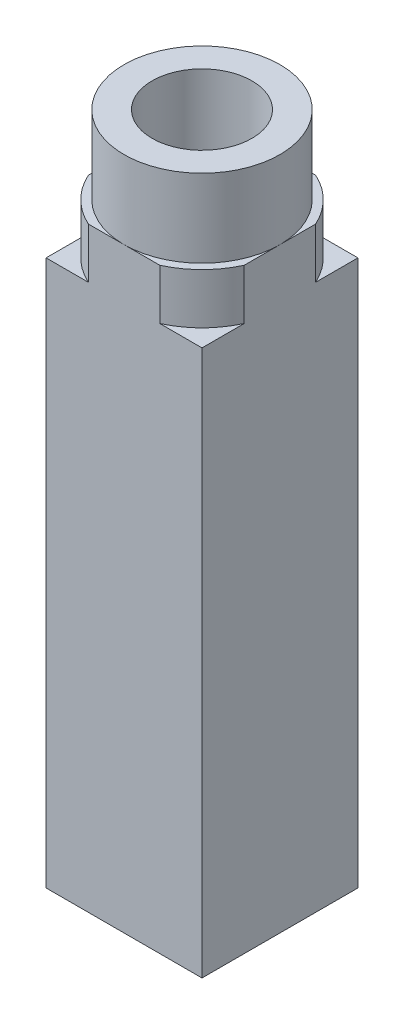
ISO-10303-21;
HEADER;
FILE_DESCRIPTION(('STEP AP214'),'2;1');
FILE_NAME('part.step','',(''),(''),'','','');
FILE_SCHEMA(('AUTOMOTIVE_DESIGN { 1 0 10303 214 1 1 1 1 }'));
ENDSEC;
DATA;
#1=APPLICATION_CONTEXT('core data for automotive mechanical design processes');
#2=APPLICATION_PROTOCOL_DEFINITION('international standard','automotive_design',2000,#1);
#3=PRODUCT_CONTEXT('',#1,'mechanical');
#4=PRODUCT('Part','Part','',(#3));
#5=PRODUCT_RELATED_PRODUCT_CATEGORY('part','',(#4));
#6=PRODUCT_DEFINITION_FORMATION('','',#4);
#7=PRODUCT_DEFINITION_CONTEXT('part definition',#1,'design');
#8=PRODUCT_DEFINITION('design','',#6,#7);
#9=PRODUCT_DEFINITION_SHAPE('','',#8);
#10=(LENGTH_UNIT() NAMED_UNIT(*) SI_UNIT(.MILLI.,.METRE.));
#11=(NAMED_UNIT(*) PLANE_ANGLE_UNIT() SI_UNIT($,.RADIAN.));
#12=(NAMED_UNIT(*) SI_UNIT($,.STERADIAN.) SOLID_ANGLE_UNIT());
#13=UNCERTAINTY_MEASURE_WITH_UNIT(LENGTH_MEASURE(1.E-05),#10,'distance_accuracy_value','');
#14=(GEOMETRIC_REPRESENTATION_CONTEXT(3) GLOBAL_UNCERTAINTY_ASSIGNED_CONTEXT((#13)) GLOBAL_UNIT_ASSIGNED_CONTEXT((#10,
#11,#12)) REPRESENTATION_CONTEXT('',''));
#15=CARTESIAN_POINT('',(0.,0.,0.));
#16=DIRECTION('',(0.,0.,1.));
#17=DIRECTION('',(1.,0.,0.));
#18=AXIS2_PLACEMENT_3D('',#15,#16,#17);
#19=CARTESIAN_POINT('',(0.,22.225,0.));
#20=DIRECTION('',(0.,1.,0.));
#21=DIRECTION('',(0.,0.,1.));
#22=AXIS2_PLACEMENT_3D('',#19,#20,#21);
#23=PLANE('',#22);
#24=DIRECTION('',(0.,0.,-1.));
#25=VECTOR('',#24,1.);
#26=CARTESIAN_POINT('',(3.175,22.225,-3.175));
#27=LINE('',#26,#25);
#28=CARTESIAN_POINT('',(3.175,22.225,3.175));
#29=VERTEX_POINT('',#28);
#30=CARTESIAN_POINT('',(3.175,22.225,1.45496778314848));
#31=VERTEX_POINT('',#30);
#32=EDGE_CURVE('E2280',#29,#31,#27,.T.);
#33=ORIENTED_EDGE('',*,*,#32,.T.);
#34=CARTESIAN_POINT('',(0.,22.225,0.));
#35=DIRECTION('',(0.,1.,0.));
#36=DIRECTION('',(0.,0.,1.));
#37=AXIS2_PLACEMENT_3D('',#34,#35,#36);
#38=CIRCLE('',#37,3.4925);
#39=CARTESIAN_POINT('',(1.45496778314848,22.225,3.175));
#40=VERTEX_POINT('',#39);
#41=EDGE_CURVE('E2369',#31,#40,#38,.F.);
#42=ORIENTED_EDGE('',*,*,#41,.T.);
#43=DIRECTION('',(1.,0.,0.));
#44=VECTOR('',#43,1.);
#45=CARTESIAN_POINT('',(-3.175,22.225,3.175));
#46=LINE('',#45,#44);
#47=EDGE_CURVE('E2295',#40,#29,#46,.T.);
#48=ORIENTED_EDGE('',*,*,#47,.T.);
#49=EDGE_LOOP('',(#33,#42,#48));
#50=FACE_BOUND('',#49,.T.);
#51=ADVANCED_FACE('F2086',(#50),#23,.T.);
#52=DIRECTION('',(-1.,0.,0.));
#53=VECTOR('',#52,1.);
#54=CARTESIAN_POINT('',(-3.175,22.225,-3.175));
#55=LINE('',#54,#53);
#56=CARTESIAN_POINT('',(3.175,22.225,-3.175));
#57=VERTEX_POINT('',#56);
#58=CARTESIAN_POINT('',(1.45496778314848,22.225,-3.175));
#59=VERTEX_POINT('',#58);
#60=EDGE_CURVE('E2281',#57,#59,#55,.T.);
#61=ORIENTED_EDGE('',*,*,#60,.T.);
#62=CARTESIAN_POINT('',(0.,22.225,0.));
#63=DIRECTION('',(0.,1.,0.));
#64=DIRECTION('',(0.,0.,1.));
#65=AXIS2_PLACEMENT_3D('',#62,#63,#64);
#66=CIRCLE('',#65,3.4925);
#67=CARTESIAN_POINT('',(3.175,22.225,-1.45496778314848));
#68=VERTEX_POINT('',#67);
#69=EDGE_CURVE('E2349',#59,#68,#66,.F.);
#70=ORIENTED_EDGE('',*,*,#69,.T.);
#71=EDGE_CURVE('E2284',#68,#57,#27,.T.);
#72=ORIENTED_EDGE('',*,*,#71,.T.);
#73=EDGE_LOOP('',(#61,#70,#72));
#74=FACE_BOUND('',#73,.T.);
#75=ADVANCED_FACE('F2351',(#74),#23,.T.);
#76=DIRECTION('',(0.,0.,1.));
#77=VECTOR('',#76,1.);
#78=CARTESIAN_POINT('',(-3.175,22.225,-3.175));
#79=LINE('',#78,#77);
#80=CARTESIAN_POINT('',(-3.175,22.225,-3.175));
#81=VERTEX_POINT('',#80);
#82=CARTESIAN_POINT('',(-3.175,22.225,-1.45496778314848));
#83=VERTEX_POINT('',#82);
#84=EDGE_CURVE('E2290',#81,#83,#79,.T.);
#85=ORIENTED_EDGE('',*,*,#84,.T.);
#86=CARTESIAN_POINT('',(0.,22.225,0.));
#87=DIRECTION('',(0.,1.,0.));
#88=DIRECTION('',(0.,0.,1.));
#89=AXIS2_PLACEMENT_3D('',#86,#87,#88);
#90=CIRCLE('',#89,3.4925);
#91=CARTESIAN_POINT('',(-1.45496778314848,22.225,-3.175));
#92=VERTEX_POINT('',#91);
#93=EDGE_CURVE('E2192',#83,#92,#90,.F.);
#94=ORIENTED_EDGE('',*,*,#93,.T.);
#95=EDGE_CURVE('E2285',#92,#81,#55,.T.);
#96=ORIENTED_EDGE('',*,*,#95,.T.);
#97=EDGE_LOOP('',(#85,#94,#96));
#98=FACE_BOUND('',#97,.T.);
#99=ADVANCED_FACE('F2412',(#98),#23,.T.);
#100=CARTESIAN_POINT('',(-3.175,22.225,3.175));
#101=VERTEX_POINT('',#100);
#102=CARTESIAN_POINT('',(-1.45496778314848,22.225,3.175));
#103=VERTEX_POINT('',#102);
#104=EDGE_CURVE('E2291',#101,#103,#46,.T.);
#105=ORIENTED_EDGE('',*,*,#104,.T.);
#106=CARTESIAN_POINT('',(0.,22.225,0.));
#107=DIRECTION('',(0.,1.,0.));
#108=DIRECTION('',(0.,0.,1.));
#109=AXIS2_PLACEMENT_3D('',#106,#107,#108);
#110=CIRCLE('',#109,3.4925);
#111=CARTESIAN_POINT('',(-3.175,22.225,1.45496778314848));
#112=VERTEX_POINT('',#111);
#113=EDGE_CURVE('E2252',#103,#112,#110,.F.);
#114=ORIENTED_EDGE('',*,*,#113,.T.);
#115=EDGE_CURVE('E2286',#112,#101,#79,.T.);
#116=ORIENTED_EDGE('',*,*,#115,.T.);
#117=EDGE_LOOP('',(#105,#114,#116));
#118=FACE_BOUND('',#117,.T.);
#119=ADVANCED_FACE('F2407',(#118),#23,.T.);
#120=CARTESIAN_POINT('',(3.175,22.225,-3.175));
#121=DIRECTION('',(-1.,0.,0.));
#122=DIRECTION('',(0.,0.,1.));
#123=AXIS2_PLACEMENT_3D('',#120,#121,#122);
#124=PLANE('',#123);
#125=DIRECTION('',(0.,1.,0.));
#126=VECTOR('',#125,1.);
#127=CARTESIAN_POINT('',(3.175,13.2447438789308,1.45496778314848));
#128=LINE('',#127,#126);
#129=CARTESIAN_POINT('',(3.175,24.27986,1.45496778314848));
#130=VERTEX_POINT('',#129);
#131=EDGE_CURVE('E2262',#31,#130,#128,.T.);
#132=ORIENTED_EDGE('',*,*,#131,.F.);
#133=ORIENTED_EDGE('',*,*,#32,.F.);
#134=DIRECTION('',(0.,-1.,0.));
#135=VECTOR('',#134,1.);
#136=CARTESIAN_POINT('',(3.175,22.225,3.175));
#137=LINE('',#136,#135);
#138=CARTESIAN_POINT('',(3.175,0.,3.175));
#139=VERTEX_POINT('',#138);
#140=EDGE_CURVE('E2300',#29,#139,#137,.T.);
#141=ORIENTED_EDGE('',*,*,#140,.T.);
#142=DIRECTION('',(0.,0.,-1.));
#143=VECTOR('',#142,1.);
#144=CARTESIAN_POINT('',(3.175,0.,-3.175));
#145=LINE('',#144,#143);
#146=CARTESIAN_POINT('',(3.175,0.,-3.175));
#147=VERTEX_POINT('',#146);
#148=EDGE_CURVE('E2279',#139,#147,#145,.T.);
#149=ORIENTED_EDGE('',*,*,#148,.T.);
#150=DIRECTION('',(0.,-1.,0.));
#151=VECTOR('',#150,1.);
#152=CARTESIAN_POINT('',(3.175,22.225,-3.175));
#153=LINE('',#152,#151);
#154=EDGE_CURVE('E2316',#57,#147,#153,.T.);
#155=ORIENTED_EDGE('',*,*,#154,.F.);
#156=ORIENTED_EDGE('',*,*,#71,.F.);
#157=DIRECTION('',(0.,1.,0.));
#158=VECTOR('',#157,1.);
#159=CARTESIAN_POINT('',(3.175,13.2447438789308,-1.45496778314848));
#160=LINE('',#159,#158);
#161=CARTESIAN_POINT('',(3.175,24.27986,-1.45496778314848));
#162=VERTEX_POINT('',#161);
#163=EDGE_CURVE('E2260',#68,#162,#160,.T.);
#164=ORIENTED_EDGE('',*,*,#163,.T.);
#165=DIRECTION('',(0.,0.,-1.));
#166=VECTOR('',#165,1.);
#167=CARTESIAN_POINT('',(3.175,24.27986,0.));
#168=LINE('',#167,#166);
#169=CARTESIAN_POINT('',(3.175,24.27986,0.));
#170=VERTEX_POINT('',#169);
#171=EDGE_CURVE('E2236',#170,#162,#168,.T.);
#172=ORIENTED_EDGE('',*,*,#171,.F.);
#173=EDGE_CURVE('E2239',#130,#170,#168,.T.);
#174=ORIENTED_EDGE('',*,*,#173,.F.);
#175=EDGE_LOOP('',(#132,#133,#141,#149,#155,#156,#164,#172,#174));
#176=FACE_BOUND('',#175,.T.);
#177=ADVANCED_FACE('F2087',(#176),#124,.F.);
#178=CARTESIAN_POINT('',(-3.175,22.225,-3.175));
#179=DIRECTION('',(0.,0.,1.));
#180=DIRECTION('',(1.,0.,0.));
#181=AXIS2_PLACEMENT_3D('',#178,#179,#180);
#182=PLANE('',#181);
#183=DIRECTION('',(0.,1.,0.));
#184=VECTOR('',#183,1.);
#185=CARTESIAN_POINT('',(1.45496778314848,13.2447438789308,-3.175));
#186=LINE('',#185,#184);
#187=CARTESIAN_POINT('',(1.45496778314848,24.27986,-3.175));
#188=VERTEX_POINT('',#187);
#189=EDGE_CURVE('E2253',#59,#188,#186,.T.);
#190=ORIENTED_EDGE('',*,*,#189,.F.);
#191=ORIENTED_EDGE('',*,*,#60,.F.);
#192=ORIENTED_EDGE('',*,*,#154,.T.);
#193=DIRECTION('',(-1.,0.,0.));
#194=VECTOR('',#193,1.);
#195=CARTESIAN_POINT('',(-3.175,0.,-3.175));
#196=LINE('',#195,#194);
#197=CARTESIAN_POINT('',(-3.175,0.,-3.175));
#198=VERTEX_POINT('',#197);
#199=EDGE_CURVE('E2299',#147,#198,#196,.T.);
#200=ORIENTED_EDGE('',*,*,#199,.T.);
#201=DIRECTION('',(0.,-1.,0.));
#202=VECTOR('',#201,1.);
#203=CARTESIAN_POINT('',(-3.175,22.225,-3.175));
#204=LINE('',#203,#202);
#205=EDGE_CURVE('E2317',#81,#198,#204,.T.);
#206=ORIENTED_EDGE('',*,*,#205,.F.);
#207=ORIENTED_EDGE('',*,*,#95,.F.);
#208=DIRECTION('',(0.,1.,0.));
#209=VECTOR('',#208,1.);
#210=CARTESIAN_POINT('',(-1.45496778314848,13.2447438789308,-3.175));
#211=LINE('',#210,#209);
#212=CARTESIAN_POINT('',(-1.45496778314848,24.27986,-3.175));
#213=VERTEX_POINT('',#212);
#214=EDGE_CURVE('E2249',#92,#213,#211,.T.);
#215=ORIENTED_EDGE('',*,*,#214,.T.);
#216=DIRECTION('',(-1.,0.,0.));
#217=VECTOR('',#216,1.);
#218=CARTESIAN_POINT('',(0.,24.27986,-3.175));
#219=LINE('',#218,#217);
#220=CARTESIAN_POINT('',(0.,24.27986,-3.175));
#221=VERTEX_POINT('',#220);
#222=EDGE_CURVE('E2215',#221,#213,#219,.T.);
#223=ORIENTED_EDGE('',*,*,#222,.F.);
#224=EDGE_CURVE('E2198',#188,#221,#219,.T.);
#225=ORIENTED_EDGE('',*,*,#224,.F.);
#226=EDGE_LOOP('',(#190,#191,#192,#200,#206,#207,#215,#223,#225));
#227=FACE_BOUND('',#226,.T.);
#228=ADVANCED_FACE('F2343',(#227),#182,.F.);
#229=CARTESIAN_POINT('',(-3.175,22.225,-3.175));
#230=DIRECTION('',(1.,0.,0.));
#231=DIRECTION('',(0.,0.,-1.));
#232=AXIS2_PLACEMENT_3D('',#229,#230,#231);
#233=PLANE('',#232);
#234=DIRECTION('',(0.,1.,0.));
#235=VECTOR('',#234,1.);
#236=CARTESIAN_POINT('',(-3.175,13.2447438789308,-1.45496778314848));
#237=LINE('',#236,#235);
#238=CARTESIAN_POINT('',(-3.175,24.27986,-1.45496778314848));
#239=VERTEX_POINT('',#238);
#240=EDGE_CURVE('E2188',#83,#239,#237,.T.);
#241=ORIENTED_EDGE('',*,*,#240,.F.);
#242=ORIENTED_EDGE('',*,*,#84,.F.);
#243=ORIENTED_EDGE('',*,*,#205,.T.);
#244=DIRECTION('',(0.,0.,1.));
#245=VECTOR('',#244,1.);
#246=CARTESIAN_POINT('',(-3.175,0.,-3.175));
#247=LINE('',#246,#245);
#248=CARTESIAN_POINT('',(-3.175,0.,3.175));
#249=VERTEX_POINT('',#248);
#250=EDGE_CURVE('E2303',#198,#249,#247,.T.);
#251=ORIENTED_EDGE('',*,*,#250,.T.);
#252=DIRECTION('',(0.,-1.,0.));
#253=VECTOR('',#252,1.);
#254=CARTESIAN_POINT('',(-3.175,22.225,3.175));
#255=LINE('',#254,#253);
#256=EDGE_CURVE('E2315',#101,#249,#255,.T.);
#257=ORIENTED_EDGE('',*,*,#256,.F.);
#258=ORIENTED_EDGE('',*,*,#115,.F.);
#259=DIRECTION('',(0.,1.,0.));
#260=VECTOR('',#259,1.);
#261=CARTESIAN_POINT('',(-3.175,13.2447438789308,1.45496778314848));
#262=LINE('',#261,#260);
#263=CARTESIAN_POINT('',(-3.175,24.27986,1.45496778314848));
#264=VERTEX_POINT('',#263);
#265=EDGE_CURVE('E2104',#112,#264,#262,.T.);
#266=ORIENTED_EDGE('',*,*,#265,.T.);
#267=DIRECTION('',(0.,0.,1.));
#268=VECTOR('',#267,1.);
#269=CARTESIAN_POINT('',(-3.175,24.27986,0.));
#270=LINE('',#269,#268);
#271=CARTESIAN_POINT('',(-3.175,24.27986,0.));
#272=VERTEX_POINT('',#271);
#273=EDGE_CURVE('E2203',#272,#264,#270,.T.);
#274=ORIENTED_EDGE('',*,*,#273,.F.);
#275=EDGE_CURVE('E2204',#239,#272,#270,.T.);
#276=ORIENTED_EDGE('',*,*,#275,.F.);
#277=EDGE_LOOP('',(#241,#242,#243,#251,#257,#258,#266,#274,#276));
#278=FACE_BOUND('',#277,.T.);
#279=ADVANCED_FACE('F2201',(#278),#233,.F.);
#280=CARTESIAN_POINT('',(-3.175,22.225,3.175));
#281=DIRECTION('',(0.,0.,-1.));
#282=DIRECTION('',(-1.,0.,0.));
#283=AXIS2_PLACEMENT_3D('',#280,#281,#282);
#284=PLANE('',#283);
#285=ORIENTED_EDGE('',*,*,#47,.F.);
#286=DIRECTION('',(0.,1.,0.));
#287=VECTOR('',#286,1.);
#288=CARTESIAN_POINT('',(1.45496778314848,13.2447438789308,3.175));
#289=LINE('',#288,#287);
#290=CARTESIAN_POINT('',(1.45496778314848,24.27986,3.175));
#291=VERTEX_POINT('',#290);
#292=EDGE_CURVE('E2261',#40,#291,#289,.T.);
#293=ORIENTED_EDGE('',*,*,#292,.T.);
#294=DIRECTION('',(1.,0.,0.));
#295=VECTOR('',#294,1.);
#296=CARTESIAN_POINT('',(0.,24.27986,3.175));
#297=LINE('',#296,#295);
#298=CARTESIAN_POINT('',(0.,24.27986,3.175));
#299=VERTEX_POINT('',#298);
#300=EDGE_CURVE('E2226',#299,#291,#297,.T.);
#301=ORIENTED_EDGE('',*,*,#300,.F.);
#302=CARTESIAN_POINT('',(-1.45496778314848,24.27986,3.175));
#303=VERTEX_POINT('',#302);
#304=EDGE_CURVE('E2228',#303,#299,#297,.T.);
#305=ORIENTED_EDGE('',*,*,#304,.F.);
#306=DIRECTION('',(0.,1.,0.));
#307=VECTOR('',#306,1.);
#308=CARTESIAN_POINT('',(-1.45496778314848,13.2447438789308,3.175));
#309=LINE('',#308,#307);
#310=EDGE_CURVE('E2269',#103,#303,#309,.T.);
#311=ORIENTED_EDGE('',*,*,#310,.F.);
#312=ORIENTED_EDGE('',*,*,#104,.F.);
#313=ORIENTED_EDGE('',*,*,#256,.T.);
#314=DIRECTION('',(1.,0.,0.));
#315=VECTOR('',#314,1.);
#316=CARTESIAN_POINT('',(-3.175,0.,3.175));
#317=LINE('',#316,#315);
#318=EDGE_CURVE('E2306',#249,#139,#317,.T.);
#319=ORIENTED_EDGE('',*,*,#318,.T.);
#320=ORIENTED_EDGE('',*,*,#140,.F.);
#321=EDGE_LOOP('',(#285,#293,#301,#305,#311,#312,#313,#319,#320));
#322=FACE_BOUND('',#321,.T.);
#323=ADVANCED_FACE('F2403',(#322),#284,.F.);
#324=CARTESIAN_POINT('',(0.,0.,0.));
#325=DIRECTION('',(0.,1.,0.));
#326=DIRECTION('',(0.,0.,1.));
#327=AXIS2_PLACEMENT_3D('',#324,#325,#326);
#328=PLANE('',#327);
#329=CARTESIAN_POINT('',(0.,0.,0.));
#330=DIRECTION('',(0.,-1.,0.));
#331=DIRECTION('',(0.,0.,-1.));
#332=AXIS2_PLACEMENT_3D('',#329,#330,#331);
#333=CIRCLE('',#332,1.984375);
#334=CARTESIAN_POINT('',(0.,0.,-1.984375));
#335=VERTEX_POINT('',#334);
#336=EDGE_CURVE('E2222',#335,#335,#333,.T.);
#337=ORIENTED_EDGE('',*,*,#336,.F.);
#338=EDGE_LOOP('',(#337));
#339=FACE_BOUND('',#338,.T.);
#340=ORIENTED_EDGE('',*,*,#250,.F.);
#341=ORIENTED_EDGE('',*,*,#199,.F.);
#342=ORIENTED_EDGE('',*,*,#148,.F.);
#343=ORIENTED_EDGE('',*,*,#318,.F.);
#344=EDGE_LOOP('',(#340,#341,#342,#343));
#345=FACE_BOUND('',#344,.T.);
#346=ADVANCED_FACE('F2427',(#339,#345),#328,.F.);
#347=CARTESIAN_POINT('',(0.,24.27986,0.));
#348=DIRECTION('',(0.,1.,0.));
#349=DIRECTION('',(0.,0.,1.));
#350=AXIS2_PLACEMENT_3D('',#347,#348,#349);
#351=PLANE('',#350);
#352=ORIENTED_EDGE('',*,*,#304,.T.);
#353=CARTESIAN_POINT('',(0.,24.27986,0.));
#354=DIRECTION('',(0.,1.,0.));
#355=DIRECTION('',(0.,0.,1.));
#356=AXIS2_PLACEMENT_3D('',#353,#354,#355);
#357=CIRCLE('',#356,3.175);
#358=EDGE_CURVE('E12',#299,#272,#357,.F.);
#359=ORIENTED_EDGE('',*,*,#358,.T.);
#360=ORIENTED_EDGE('',*,*,#273,.T.);
#361=CARTESIAN_POINT('',(0.,24.27986,0.));
#362=DIRECTION('',(0.,1.,0.));
#363=DIRECTION('',(0.,0.,1.));
#364=AXIS2_PLACEMENT_3D('',#361,#362,#363);
#365=CIRCLE('',#364,3.4925);
#366=EDGE_CURVE('E2210',#264,#303,#365,.T.);
#367=ORIENTED_EDGE('',*,*,#366,.T.);
#368=EDGE_LOOP('',(#352,#359,#360,#367));
#369=FACE_BOUND('',#368,.T.);
#370=ADVANCED_FACE('F2426',(#369),#351,.T.);
#371=ORIENTED_EDGE('',*,*,#275,.T.);
#372=EDGE_CURVE('E2097',#272,#221,#357,.F.);
#373=ORIENTED_EDGE('',*,*,#372,.T.);
#374=ORIENTED_EDGE('',*,*,#222,.T.);
#375=CARTESIAN_POINT('',(0.,24.27986,0.));
#376=DIRECTION('',(0.,1.,0.));
#377=DIRECTION('',(0.,0.,1.));
#378=AXIS2_PLACEMENT_3D('',#375,#376,#377);
#379=CIRCLE('',#378,3.4925);
#380=EDGE_CURVE('E2195',#213,#239,#379,.T.);
#381=ORIENTED_EDGE('',*,*,#380,.T.);
#382=EDGE_LOOP('',(#371,#373,#374,#381));
#383=FACE_BOUND('',#382,.T.);
#384=ADVANCED_FACE('F2208',(#383),#351,.T.);
#385=ORIENTED_EDGE('',*,*,#224,.T.);
#386=EDGE_CURVE('E2326',#221,#170,#357,.F.);
#387=ORIENTED_EDGE('',*,*,#386,.T.);
#388=ORIENTED_EDGE('',*,*,#171,.T.);
#389=CARTESIAN_POINT('',(0.,24.27986,0.));
#390=DIRECTION('',(0.,1.,0.));
#391=DIRECTION('',(0.,0.,1.));
#392=AXIS2_PLACEMENT_3D('',#389,#390,#391);
#393=CIRCLE('',#392,3.4925);
#394=EDGE_CURVE('E2243',#162,#188,#393,.T.);
#395=ORIENTED_EDGE('',*,*,#394,.T.);
#396=EDGE_LOOP('',(#385,#387,#388,#395));
#397=FACE_BOUND('',#396,.T.);
#398=ADVANCED_FACE('F2345',(#397),#351,.T.);
#399=CARTESIAN_POINT('',(0.,13.2447438789308,0.));
#400=DIRECTION('',(0.,1.,0.));
#401=DIRECTION('',(0.,0.,1.));
#402=AXIS2_PLACEMENT_3D('',#399,#400,#401);
#403=CYLINDRICAL_SURFACE('',#402,3.4925);
#404=ORIENTED_EDGE('',*,*,#93,.F.);
#405=ORIENTED_EDGE('',*,*,#240,.T.);
#406=ORIENTED_EDGE('',*,*,#380,.F.);
#407=ORIENTED_EDGE('',*,*,#214,.F.);
#408=EDGE_LOOP('',(#404,#405,#406,#407));
#409=FACE_BOUND('',#408,.T.);
#410=ADVANCED_FACE('F2189',(#409),#403,.T.);
#411=CARTESIAN_POINT('',(0.,13.2447438789308,0.));
#412=DIRECTION('',(0.,1.,0.));
#413=DIRECTION('',(0.,0.,1.));
#414=AXIS2_PLACEMENT_3D('',#411,#412,#413);
#415=CYLINDRICAL_SURFACE('',#414,3.4925);
#416=ORIENTED_EDGE('',*,*,#69,.F.);
#417=ORIENTED_EDGE('',*,*,#189,.T.);
#418=ORIENTED_EDGE('',*,*,#394,.F.);
#419=ORIENTED_EDGE('',*,*,#163,.F.);
#420=EDGE_LOOP('',(#416,#417,#418,#419));
#421=FACE_BOUND('',#420,.T.);
#422=ADVANCED_FACE('F2350',(#421),#415,.T.);
#423=CARTESIAN_POINT('',(0.,13.2447438789308,0.));
#424=DIRECTION('',(0.,1.,0.));
#425=DIRECTION('',(0.,0.,1.));
#426=AXIS2_PLACEMENT_3D('',#423,#424,#425);
#427=CYLINDRICAL_SURFACE('',#426,3.4925);
#428=ORIENTED_EDGE('',*,*,#41,.F.);
#429=ORIENTED_EDGE('',*,*,#131,.T.);
#430=CARTESIAN_POINT('',(0.,24.27986,0.));
#431=DIRECTION('',(0.,1.,0.));
#432=DIRECTION('',(0.,0.,1.));
#433=AXIS2_PLACEMENT_3D('',#430,#431,#432);
#434=CIRCLE('',#433,3.4925);
#435=EDGE_CURVE('E2235',#291,#130,#434,.T.);
#436=ORIENTED_EDGE('',*,*,#435,.F.);
#437=ORIENTED_EDGE('',*,*,#292,.F.);
#438=EDGE_LOOP('',(#428,#429,#436,#437));
#439=FACE_BOUND('',#438,.T.);
#440=ADVANCED_FACE('F2404',(#439),#427,.T.);
#441=CARTESIAN_POINT('',(0.,13.2447438789308,0.));
#442=DIRECTION('',(0.,1.,0.));
#443=DIRECTION('',(0.,0.,1.));
#444=AXIS2_PLACEMENT_3D('',#441,#442,#443);
#445=CYLINDRICAL_SURFACE('',#444,3.4925);
#446=ORIENTED_EDGE('',*,*,#113,.F.);
#447=ORIENTED_EDGE('',*,*,#310,.T.);
#448=ORIENTED_EDGE('',*,*,#366,.F.);
#449=ORIENTED_EDGE('',*,*,#265,.F.);
#450=EDGE_LOOP('',(#446,#447,#448,#449));
#451=FACE_BOUND('',#450,.T.);
#452=ADVANCED_FACE('F2481',(#451),#445,.T.);
#453=ORIENTED_EDGE('',*,*,#173,.T.);
#454=EDGE_CURVE('E2089',#170,#299,#357,.F.);
#455=ORIENTED_EDGE('',*,*,#454,.T.);
#456=ORIENTED_EDGE('',*,*,#300,.T.);
#457=ORIENTED_EDGE('',*,*,#435,.T.);
#458=EDGE_LOOP('',(#453,#455,#456,#457));
#459=FACE_BOUND('',#458,.T.);
#460=ADVANCED_FACE('F2398',(#459),#351,.T.);
#461=CARTESIAN_POINT('',(0.,27.45486,0.));
#462=DIRECTION('',(0.,-1.,0.));
#463=DIRECTION('',(0.,0.,-1.));
#464=AXIS2_PLACEMENT_3D('',#461,#462,#463);
#465=PLANE('',#464);
#466=CARTESIAN_POINT('',(0.,27.45486,0.));
#467=DIRECTION('',(0.,1.,0.));
#468=DIRECTION('',(0.,0.,1.));
#469=AXIS2_PLACEMENT_3D('',#466,#467,#468);
#470=CIRCLE('',#469,2.032);
#471=CARTESIAN_POINT('',(0.,27.45486,2.032));
#472=VERTEX_POINT('',#471);
#473=EDGE_CURVE('E2660',#472,#472,#470,.T.);
#474=ORIENTED_EDGE('',*,*,#473,.F.);
#475=EDGE_LOOP('',(#474));
#476=FACE_BOUND('',#475,.T.);
#477=CARTESIAN_POINT('',(0.,27.45486,0.));
#478=DIRECTION('',(0.,-1.,0.));
#479=DIRECTION('',(0.,0.,-1.));
#480=AXIS2_PLACEMENT_3D('',#477,#478,#479);
#481=CIRCLE('',#480,3.175);
#482=CARTESIAN_POINT('',(0.,27.45486,-3.175));
#483=VERTEX_POINT('',#482);
#484=EDGE_CURVE('E2271',#483,#483,#481,.T.);
#485=ORIENTED_EDGE('',*,*,#484,.F.);
#486=EDGE_LOOP('',(#485));
#487=FACE_BOUND('',#486,.T.);
#488=ADVANCED_FACE('F2496',(#476,#487),#465,.F.);
#489=CARTESIAN_POINT('',(0.,27.45486,0.));
#490=DIRECTION('',(0.,-1.,0.));
#491=DIRECTION('',(0.,0.,-1.));
#492=AXIS2_PLACEMENT_3D('',#489,#490,#491);
#493=CYLINDRICAL_SURFACE('',#492,3.175);
#494=ORIENTED_EDGE('',*,*,#358,.F.);
#495=ORIENTED_EDGE('',*,*,#454,.F.);
#496=ORIENTED_EDGE('',*,*,#386,.F.);
#497=ORIENTED_EDGE('',*,*,#372,.F.);
#498=EDGE_LOOP('',(#494,#495,#496,#497));
#499=FACE_BOUND('',#498,.T.);
#500=ORIENTED_EDGE('',*,*,#484,.T.);
#501=EDGE_LOOP('',(#500));
#502=FACE_BOUND('',#501,.T.);
#503=ADVANCED_FACE('F2421',(#499,#502),#493,.T.);
#504=CARTESIAN_POINT('',(0.,12.7,0.));
#505=DIRECTION('',(0.,-1.,0.));
#506=DIRECTION('',(0.,0.,-1.));
#507=AXIS2_PLACEMENT_3D('',#504,#505,#506);
#508=CYLINDRICAL_SURFACE('',#507,1.984375);
#509=CARTESIAN_POINT('',(0.,12.7,0.));
#510=DIRECTION('',(0.,-1.,0.));
#511=DIRECTION('',(0.,0.,-1.));
#512=AXIS2_PLACEMENT_3D('',#509,#510,#511);
#513=CIRCLE('',#512,1.984375);
#514=CARTESIAN_POINT('',(0.,12.7,-1.984375));
#515=VERTEX_POINT('',#514);
#516=EDGE_CURVE('E2213',#515,#515,#513,.T.);
#517=ORIENTED_EDGE('',*,*,#516,.F.);
#518=EDGE_LOOP('',(#517));
#519=FACE_BOUND('',#518,.T.);
#520=ORIENTED_EDGE('',*,*,#336,.T.);
#521=EDGE_LOOP('',(#520));
#522=FACE_BOUND('',#521,.T.);
#523=ADVANCED_FACE('F2508',(#519,#522),#508,.F.);
#524=CARTESIAN_POINT('',(0.,12.7,0.));
#525=DIRECTION('',(0.,-1.,0.));
#526=DIRECTION('',(0.,0.,-1.));
#527=AXIS2_PLACEMENT_3D('',#524,#525,#526);
#528=PLANE('',#527);
#529=ORIENTED_EDGE('',*,*,#516,.T.);
#530=EDGE_LOOP('',(#529));
#531=FACE_BOUND('',#530,.T.);
#532=ADVANCED_FACE('F2519',(#531),#528,.T.);
#533=CARTESIAN_POINT('',(0.,14.75486,0.));
#534=DIRECTION('',(0.,1.,0.));
#535=DIRECTION('',(0.,0.,1.));
#536=AXIS2_PLACEMENT_3D('',#533,#534,#535);
#537=CYLINDRICAL_SURFACE('',#536,2.032);
#538=CARTESIAN_POINT('',(0.,14.75486,0.));
#539=DIRECTION('',(0.,1.,0.));
#540=DIRECTION('',(0.,0.,1.));
#541=AXIS2_PLACEMENT_3D('',#538,#539,#540);
#542=CIRCLE('',#541,2.032);
#543=CARTESIAN_POINT('',(0.,14.75486,2.032));
#544=VERTEX_POINT('',#543);
#545=EDGE_CURVE('E2653',#544,#544,#542,.T.);
#546=ORIENTED_EDGE('',*,*,#545,.F.);
#547=EDGE_LOOP('',(#546));
#548=FACE_BOUND('',#547,.T.);
#549=ORIENTED_EDGE('',*,*,#473,.T.);
#550=EDGE_LOOP('',(#549));
#551=FACE_BOUND('',#550,.T.);
#552=ADVANCED_FACE('F2528',(#548,#551),#537,.F.);
#553=CARTESIAN_POINT('',(0.,14.75486,0.));
#554=DIRECTION('',(0.,1.,0.));
#555=DIRECTION('',(0.,0.,1.));
#556=AXIS2_PLACEMENT_3D('',#553,#554,#555);
#557=PLANE('',#556);
#558=ORIENTED_EDGE('',*,*,#545,.T.);
#559=EDGE_LOOP('',(#558));
#560=FACE_BOUND('',#559,.T.);
#561=ADVANCED_FACE('F2543',(#560),#557,.T.);
#562=CLOSED_SHELL('',(#51,#75,#99,#119,#177,#228,#279,#323,#346,#370,#384,#398,#410,#422,#440,
#452,#460,#488,#503,#523,#532,#552,#561));
#563=MANIFOLD_SOLID_BREP('B2',#562);
#564=ADVANCED_BREP_SHAPE_REPRESENTATION('',(#18,#563),#14);
#565=SHAPE_DEFINITION_REPRESENTATION(#9,#564);
ENDSEC;
END-ISO-10303-21;
